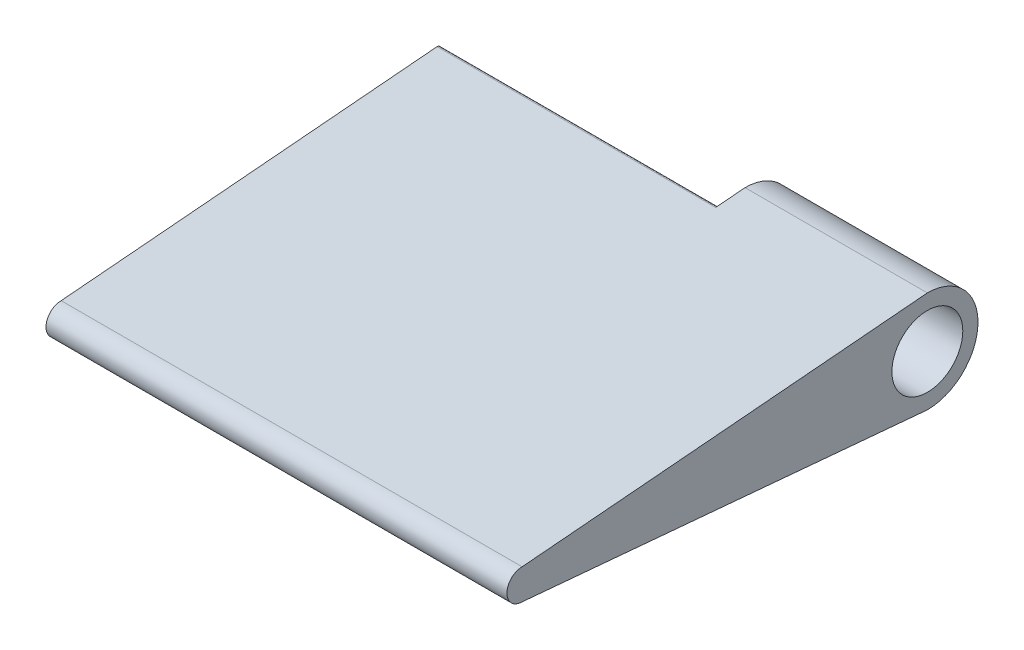
ISO-10303-21;
HEADER;
FILE_DESCRIPTION(('STEP AP214'),'2;1');
FILE_NAME('part.step','',(''),(''),'','','');
FILE_SCHEMA(('AUTOMOTIVE_DESIGN { 1 0 10303 214 1 1 1 1 }'));
ENDSEC;
DATA;
#1=APPLICATION_CONTEXT('core data for automotive mechanical design processes');
#2=APPLICATION_PROTOCOL_DEFINITION('international standard','automotive_design',2000,#1);
#3=PRODUCT_CONTEXT('',#1,'mechanical');
#4=PRODUCT('Part','Part','',(#3));
#5=PRODUCT_RELATED_PRODUCT_CATEGORY('part','',(#4));
#6=PRODUCT_DEFINITION_FORMATION('','',#4);
#7=PRODUCT_DEFINITION_CONTEXT('part definition',#1,'design');
#8=PRODUCT_DEFINITION('design','',#6,#7);
#9=PRODUCT_DEFINITION_SHAPE('','',#8);
#10=(LENGTH_UNIT() NAMED_UNIT(*) SI_UNIT(.MILLI.,.METRE.));
#11=(NAMED_UNIT(*) PLANE_ANGLE_UNIT() SI_UNIT($,.RADIAN.));
#12=(NAMED_UNIT(*) SI_UNIT($,.STERADIAN.) SOLID_ANGLE_UNIT());
#13=UNCERTAINTY_MEASURE_WITH_UNIT(LENGTH_MEASURE(1.E-05),#10,'distance_accuracy_value','');
#14=(GEOMETRIC_REPRESENTATION_CONTEXT(3) GLOBAL_UNCERTAINTY_ASSIGNED_CONTEXT((#13)) GLOBAL_UNIT_ASSIGNED_CONTEXT((#10,
#11,#12)) REPRESENTATION_CONTEXT('',''));
#15=CARTESIAN_POINT('',(0.,0.,0.));
#16=DIRECTION('',(0.,0.,1.));
#17=DIRECTION('',(1.,0.,0.));
#18=AXIS2_PLACEMENT_3D('',#15,#16,#17);
#19=CARTESIAN_POINT('',(-27.5,0.,0.));
#20=DIRECTION('',(1.,0.,0.));
#21=DIRECTION('',(0.,0.,-1.));
#22=AXIS2_PLACEMENT_3D('',#19,#20,#21);
#23=CYLINDRICAL_SURFACE('',#22,5.);
#24=CARTESIAN_POINT('',(-9.5,0.,0.));
#25=DIRECTION('',(-1.,0.,0.));
#26=DIRECTION('',(0.,0.,1.));
#27=AXIS2_PLACEMENT_3D('',#24,#25,#26);
#28=CIRCLE('',#27,5.);
#29=CARTESIAN_POINT('',(-9.5,-1.5377558092035,4.75765772951994));
#30=VERTEX_POINT('',#29);
#31=CARTESIAN_POINT('',(-9.5,-4.1876945933311,2.73188835661077));
#32=VERTEX_POINT('',#31);
#33=EDGE_CURVE('E73',#30,#32,#28,.F.);
#34=ORIENTED_EDGE('',*,*,#33,.F.);
#35=DIRECTION('',(1.,0.,0.));
#36=VECTOR('',#35,1.);
#37=CARTESIAN_POINT('',(-27.5,-1.5377558092035,4.75765772951995));
#38=LINE('',#37,#36);
#39=CARTESIAN_POINT('',(-27.5,-1.5377558092035,4.75765772951994));
#40=VERTEX_POINT('',#39);
#41=EDGE_CURVE('E146',#40,#30,#38,.T.);
#42=ORIENTED_EDGE('',*,*,#41,.F.);
#43=CARTESIAN_POINT('',(-27.5,0.,0.));
#44=DIRECTION('',(1.,0.,0.));
#45=DIRECTION('',(0.,0.,-1.));
#46=AXIS2_PLACEMENT_3D('',#43,#44,#45);
#47=CIRCLE('',#46,5.);
#48=CARTESIAN_POINT('',(-27.5,4.20184559186567,2.71007262303411));
#49=VERTEX_POINT('',#48);
#50=EDGE_CURVE('E186',#49,#40,#47,.T.);
#51=ORIENTED_EDGE('',*,*,#50,.F.);
#52=DIRECTION('',(1.,0.,0.));
#53=VECTOR('',#52,1.);
#54=CARTESIAN_POINT('',(-27.5,4.20184559186567,2.71007262303411));
#55=LINE('',#54,#53);
#56=CARTESIAN_POINT('',(0.,4.20184559186567,2.71007262303411));
#57=VERTEX_POINT('',#56);
#58=EDGE_CURVE('E203',#49,#57,#55,.T.);
#59=ORIENTED_EDGE('',*,*,#58,.T.);
#60=CARTESIAN_POINT('',(0.,0.,0.));
#61=DIRECTION('',(1.,0.,0.));
#62=DIRECTION('',(0.,0.,-1.));
#63=AXIS2_PLACEMENT_3D('',#60,#61,#62);
#64=CIRCLE('',#63,5.);
#65=CARTESIAN_POINT('',(0.,-4.1876945933311,2.73188835661077));
#66=VERTEX_POINT('',#65);
#67=EDGE_CURVE('E187',#57,#66,#64,.T.);
#68=ORIENTED_EDGE('',*,*,#67,.T.);
#69=DIRECTION('',(1.,0.,0.));
#70=VECTOR('',#69,1.);
#71=CARTESIAN_POINT('',(-27.5,-4.1876945933311,2.73188835661077));
#72=LINE('',#71,#70);
#73=EDGE_CURVE('E206',#66,#32,#72,.F.);
#74=ORIENTED_EDGE('',*,*,#73,.T.);
#75=EDGE_LOOP('',(#34,#42,#51,#59,#68,#74));
#76=FACE_BOUND('',#75,.T.);
#77=ADVANCED_FACE('F58',(#76),#23,.F.);
#78=CARTESIAN_POINT('',(-27.5,-4.9600647370598,0.445063466794253));
#79=DIRECTION('',(0.,-0.995998467575106,0.0893703115583744));
#80=DIRECTION('',(0.,-0.0893703115583744,-0.995998467575106));
#81=AXIS2_PLACEMENT_3D('',#78,#79,#80);
#82=PLANE('',#81);
#83=DIRECTION('',(1.,0.,0.));
#84=VECTOR('',#83,1.);
#85=CARTESIAN_POINT('',(-27.5,-1.5377558092035,38.5854077072533));
#86=LINE('',#85,#84);
#87=CARTESIAN_POINT('',(-27.5,-1.5377558092035,38.5854077072533));
#88=VERTEX_POINT('',#87);
#89=CARTESIAN_POINT('',(-9.5,-1.5377558092035,38.5854077072533));
#90=VERTEX_POINT('',#89);
#91=EDGE_CURVE('E143',#88,#90,#86,.T.);
#92=ORIENTED_EDGE('',*,*,#91,.T.);
#93=DIRECTION('',(0.,-0.0893703115583744,-0.995998467575106));
#94=VECTOR('',#93,1.);
#95=CARTESIAN_POINT('',(-9.5,-4.9600647370598,0.445063466794253));
#96=LINE('',#95,#94);
#97=CARTESIAN_POINT('',(-9.5,-4.73775580920349,2.92261275147493));
#98=VERTEX_POINT('',#97);
#99=EDGE_CURVE('E133',#90,#98,#96,.T.);
#100=ORIENTED_EDGE('',*,*,#99,.T.);
#101=DIRECTION('',(-1.,0.,0.));
#102=VECTOR('',#101,1.);
#103=CARTESIAN_POINT('',(0.,-4.7377558092035,2.92261275147493));
#104=LINE('',#103,#102);
#105=CARTESIAN_POINT('',(0.,-4.7377558092035,2.92261275147493));
#106=VERTEX_POINT('',#105);
#107=EDGE_CURVE('E198',#98,#106,#104,.F.);
#108=ORIENTED_EDGE('',*,*,#107,.T.);
#109=DIRECTION('',(0.,-0.0893703115583744,-0.995998467575106));
#110=VECTOR('',#109,1.);
#111=CARTESIAN_POINT('',(0.,-4.9600647370598,0.445063466794253));
#112=LINE('',#111,#110);
#113=CARTESIAN_POINT('',(0.,-5.,0.));
#114=VERTEX_POINT('',#113);
#115=EDGE_CURVE('E154',#106,#114,#112,.T.);
#116=ORIENTED_EDGE('',*,*,#115,.T.);
#117=DIRECTION('',(-1.,0.,0.));
#118=VECTOR('',#117,1.);
#119=CARTESIAN_POINT('',(18.,-5.,0.));
#120=LINE('',#119,#118);
#121=CARTESIAN_POINT('',(18.,-5.,0.));
#122=VERTEX_POINT('',#121);
#123=EDGE_CURVE('E181',#122,#114,#120,.T.);
#124=ORIENTED_EDGE('',*,*,#123,.F.);
#125=DIRECTION('',(0.,-0.0893703115583744,-0.995998467575106));
#126=VECTOR('',#125,1.);
#127=CARTESIAN_POINT('',(18.,-4.9600647370598,0.445063466794253));
#128=LINE('',#127,#126);
#129=CARTESIAN_POINT('',(18.,-1.41082533887995,40.));
#130=VERTEX_POINT('',#129);
#131=EDGE_CURVE('E161',#130,#122,#128,.T.);
#132=ORIENTED_EDGE('',*,*,#131,.F.);
#133=DIRECTION('',(1.,0.,0.));
#134=VECTOR('',#133,1.);
#135=CARTESIAN_POINT('',(-27.5,-1.41082533887994,40.));
#136=LINE('',#135,#134);
#137=CARTESIAN_POINT('',(-27.5,-1.41082533887994,40.));
#138=VERTEX_POINT('',#137);
#139=EDGE_CURVE('E193',#138,#130,#136,.T.);
#140=ORIENTED_EDGE('',*,*,#139,.F.);
#141=DIRECTION('',(0.,-0.0893703115583744,-0.995998467575106));
#142=VECTOR('',#141,1.);
#143=CARTESIAN_POINT('',(-27.5,-4.9600647370598,0.445063466794253));
#144=LINE('',#143,#142);
#145=EDGE_CURVE('E152',#138,#88,#144,.T.);
#146=ORIENTED_EDGE('',*,*,#145,.T.);
#147=EDGE_LOOP('',(#92,#100,#108,#116,#124,#132,#140,#146));
#148=FACE_BOUND('',#147,.T.);
#149=ADVANCED_FACE('F150',(#148),#82,.T.);
#150=CARTESIAN_POINT('',(-27.5,0.,0.));
#151=DIRECTION('',(1.,0.,0.));
#152=DIRECTION('',(0.,0.,-1.));
#153=AXIS2_PLACEMENT_3D('',#150,#151,#152);
#154=PLANE('',#153);
#155=DIRECTION('',(0.,0.,-1.));
#156=VECTOR('',#155,1.);
#157=CARTESIAN_POINT('',(-27.5,-1.5377558092035,48.));
#158=LINE('',#157,#156);
#159=EDGE_CURVE('E147',#88,#40,#158,.T.);
#160=ORIENTED_EDGE('',*,*,#159,.F.);
#161=ORIENTED_EDGE('',*,*,#145,.F.);
#162=CARTESIAN_POINT('',(-27.5,0.0891746611200548,40.));
#163=DIRECTION('',(1.,0.,0.));
#164=DIRECTION('',(0.,0.,-1.));
#165=AXIS2_PLACEMENT_3D('',#162,#163,#164);
#166=CIRCLE('',#165,1.5);
#167=CARTESIAN_POINT('',(-27.5,1.58917466112005,40.));
#168=VERTEX_POINT('',#167);
#169=EDGE_CURVE('E184',#168,#138,#166,.T.);
#170=ORIENTED_EDGE('',*,*,#169,.F.);
#171=DIRECTION('',(0.,0.084962309007415,-0.99638416589593));
#172=VECTOR('',#171,1.);
#173=CARTESIAN_POINT('',(-27.5,4.96390703024064,0.423275496964727));
#174=LINE('',#173,#172);
#175=CARTESIAN_POINT('',(-27.5,4.75287157714639,2.89816567311838));
#176=VERTEX_POINT('',#175);
#177=EDGE_CURVE('E190',#168,#176,#174,.T.);
#178=ORIENTED_EDGE('',*,*,#177,.T.);
#179=CARTESIAN_POINT('',(-27.5,4.45395632737761,2.87267698041616));
#180=DIRECTION('',(1.,0.,0.));
#181=DIRECTION('',(0.,0.,-1.));
#182=AXIS2_PLACEMENT_3D('',#179,#180,#181);
#183=CIRCLE('',#182,0.3);
#184=EDGE_CURVE('E209',#176,#49,#183,.F.);
#185=ORIENTED_EDGE('',*,*,#184,.T.);
#186=ORIENTED_EDGE('',*,*,#50,.T.);
#187=EDGE_LOOP('',(#160,#161,#170,#178,#185,#186));
#188=FACE_BOUND('',#187,.T.);
#189=ADVANCED_FACE('F226',(#188),#154,.F.);
#190=CARTESIAN_POINT('',(-27.5,-4.43895626893096,2.89580165800742));
#191=DIRECTION('',(1.,0.,0.));
#192=DIRECTION('',(0.,0.,-1.));
#193=AXIS2_PLACEMENT_3D('',#190,#191,#192);
#194=CYLINDRICAL_SURFACE('',#193,0.3);
#195=ORIENTED_EDGE('',*,*,#107,.F.);
#196=CARTESIAN_POINT('',(-9.5,-4.43895626893096,2.89580165800742));
#197=DIRECTION('',(-1.,0.,0.));
#198=DIRECTION('',(0.,0.,1.));
#199=AXIS2_PLACEMENT_3D('',#196,#197,#198);
#200=CIRCLE('',#199,0.3);
#201=EDGE_CURVE('E12',#98,#32,#200,.F.);
#202=ORIENTED_EDGE('',*,*,#201,.T.);
#203=ORIENTED_EDGE('',*,*,#73,.F.);
#204=CARTESIAN_POINT('',(0.,-4.43895626893096,2.89580165800742));
#205=DIRECTION('',(1.,0.,0.));
#206=DIRECTION('',(0.,0.,-1.));
#207=AXIS2_PLACEMENT_3D('',#204,#205,#206);
#208=CIRCLE('',#207,0.3);
#209=EDGE_CURVE('E213',#106,#66,#208,.T.);
#210=ORIENTED_EDGE('',*,*,#209,.F.);
#211=EDGE_LOOP('',(#195,#202,#203,#210));
#212=FACE_BOUND('',#211,.T.);
#213=ADVANCED_FACE('F245',(#212),#194,.T.);
#214=CARTESIAN_POINT('',(-27.5,4.96390703024064,0.423275496964727));
#215=DIRECTION('',(0.,-0.99638416589593,-0.084962309007415));
#216=DIRECTION('',(0.,0.084962309007415,-0.99638416589593));
#217=AXIS2_PLACEMENT_3D('',#214,#215,#216);
#218=PLANE('',#217);
#219=DIRECTION('',(0.,0.084962309007415,-0.99638416589593));
#220=VECTOR('',#219,1.);
#221=CARTESIAN_POINT('',(0.,4.96390703024064,0.423275496964727));
#222=LINE('',#221,#220);
#223=CARTESIAN_POINT('',(0.,4.75287157714639,2.89816567311838));
#224=VERTEX_POINT('',#223);
#225=CARTESIAN_POINT('',(0.,5.,0.));
#226=VERTEX_POINT('',#225);
#227=EDGE_CURVE('E80',#224,#226,#222,.T.);
#228=ORIENTED_EDGE('',*,*,#227,.F.);
#229=DIRECTION('',(1.,0.,0.));
#230=VECTOR('',#229,1.);
#231=CARTESIAN_POINT('',(-27.5,4.75287157714639,2.89816567311838));
#232=LINE('',#231,#230);
#233=EDGE_CURVE('E211',#224,#176,#232,.F.);
#234=ORIENTED_EDGE('',*,*,#233,.T.);
#235=ORIENTED_EDGE('',*,*,#177,.F.);
#236=DIRECTION('',(1.,0.,0.));
#237=VECTOR('',#236,1.);
#238=CARTESIAN_POINT('',(-27.5,1.58917466112005,40.));
#239=LINE('',#238,#237);
#240=CARTESIAN_POINT('',(18.,1.58917466112006,40.));
#241=VERTEX_POINT('',#240);
#242=EDGE_CURVE('E196',#168,#241,#239,.T.);
#243=ORIENTED_EDGE('',*,*,#242,.T.);
#244=DIRECTION('',(0.,0.084962309007415,-0.99638416589593));
#245=VECTOR('',#244,1.);
#246=CARTESIAN_POINT('',(18.,4.96390703024064,0.423275496964727));
#247=LINE('',#246,#245);
#248=CARTESIAN_POINT('',(18.,5.,0.));
#249=VERTEX_POINT('',#248);
#250=EDGE_CURVE('E166',#241,#249,#247,.T.);
#251=ORIENTED_EDGE('',*,*,#250,.T.);
#252=DIRECTION('',(-1.,0.,0.));
#253=VECTOR('',#252,1.);
#254=CARTESIAN_POINT('',(18.,5.,0.));
#255=LINE('',#254,#253);
#256=EDGE_CURVE('E172',#249,#226,#255,.T.);
#257=ORIENTED_EDGE('',*,*,#256,.T.);
#258=EDGE_LOOP('',(#228,#234,#235,#243,#251,#257));
#259=FACE_BOUND('',#258,.T.);
#260=ADVANCED_FACE('F223',(#259),#218,.F.);
#261=CARTESIAN_POINT('',(-27.5,0.0891746611200548,40.));
#262=DIRECTION('',(1.,0.,0.));
#263=DIRECTION('',(0.,0.,-1.));
#264=AXIS2_PLACEMENT_3D('',#261,#262,#263);
#265=CYLINDRICAL_SURFACE('',#264,1.5);
#266=ORIENTED_EDGE('',*,*,#242,.F.);
#267=ORIENTED_EDGE('',*,*,#169,.T.);
#268=ORIENTED_EDGE('',*,*,#139,.T.);
#269=CARTESIAN_POINT('',(18.,0.0891746611200548,40.));
#270=DIRECTION('',(1.,0.,0.));
#271=DIRECTION('',(0.,0.,-1.));
#272=AXIS2_PLACEMENT_3D('',#269,#270,#271);
#273=CIRCLE('',#272,1.5);
#274=EDGE_CURVE('E158',#241,#130,#273,.T.);
#275=ORIENTED_EDGE('',*,*,#274,.F.);
#276=EDGE_LOOP('',(#266,#267,#268,#275));
#277=FACE_BOUND('',#276,.T.);
#278=ADVANCED_FACE('F229',(#277),#265,.T.);
#279=CARTESIAN_POINT('',(0.,0.,0.));
#280=DIRECTION('',(1.,0.,0.));
#281=DIRECTION('',(0.,0.,-1.));
#282=AXIS2_PLACEMENT_3D('',#279,#280,#281);
#283=PLANE('',#282);
#284=CARTESIAN_POINT('',(0.,0.,0.));
#285=DIRECTION('',(1.,0.,0.));
#286=DIRECTION('',(0.,0.,-1.));
#287=AXIS2_PLACEMENT_3D('',#284,#285,#286);
#288=CIRCLE('',#287,3.5);
#289=CARTESIAN_POINT('',(0.,0.,-3.5));
#290=VERTEX_POINT('',#289);
#291=EDGE_CURVE('E162',#290,#290,#288,.T.);
#292=ORIENTED_EDGE('',*,*,#291,.T.);
#293=EDGE_LOOP('',(#292));
#294=FACE_BOUND('',#293,.T.);
#295=ORIENTED_EDGE('',*,*,#67,.F.);
#296=CARTESIAN_POINT('',(0.,4.45395632737761,2.87267698041616));
#297=DIRECTION('',(1.,0.,0.));
#298=DIRECTION('',(0.,0.,-1.));
#299=AXIS2_PLACEMENT_3D('',#296,#297,#298);
#300=CIRCLE('',#299,0.3);
#301=EDGE_CURVE('E66',#57,#224,#300,.T.);
#302=ORIENTED_EDGE('',*,*,#301,.T.);
#303=ORIENTED_EDGE('',*,*,#227,.T.);
#304=CARTESIAN_POINT('',(0.,0.,0.));
#305=DIRECTION('',(1.,0.,0.));
#306=DIRECTION('',(0.,0.,-1.));
#307=AXIS2_PLACEMENT_3D('',#304,#305,#306);
#308=CIRCLE('',#307,5.);
#309=EDGE_CURVE('E174',#114,#226,#308,.T.);
#310=ORIENTED_EDGE('',*,*,#309,.F.);
#311=ORIENTED_EDGE('',*,*,#115,.F.);
#312=ORIENTED_EDGE('',*,*,#209,.T.);
#313=EDGE_LOOP('',(#295,#302,#303,#310,#311,#312));
#314=FACE_BOUND('',#313,.T.);
#315=ADVANCED_FACE('F217',(#294,#314),#283,.F.);
#316=CARTESIAN_POINT('',(18.,0.,0.));
#317=DIRECTION('',(-1.,0.,0.));
#318=DIRECTION('',(0.,0.,1.));
#319=AXIS2_PLACEMENT_3D('',#316,#317,#318);
#320=CYLINDRICAL_SURFACE('',#319,5.);
#321=ORIENTED_EDGE('',*,*,#309,.T.);
#322=ORIENTED_EDGE('',*,*,#256,.F.);
#323=CARTESIAN_POINT('',(18.,0.,0.));
#324=DIRECTION('',(1.,0.,0.));
#325=DIRECTION('',(0.,0.,-1.));
#326=AXIS2_PLACEMENT_3D('',#323,#324,#325);
#327=CIRCLE('',#326,5.);
#328=EDGE_CURVE('E164',#122,#249,#327,.T.);
#329=ORIENTED_EDGE('',*,*,#328,.F.);
#330=ORIENTED_EDGE('',*,*,#123,.T.);
#331=EDGE_LOOP('',(#321,#322,#329,#330));
#332=FACE_BOUND('',#331,.T.);
#333=ADVANCED_FACE('F240',(#332),#320,.T.);
#334=CARTESIAN_POINT('',(18.,0.,0.));
#335=DIRECTION('',(-1.,0.,0.));
#336=DIRECTION('',(0.,0.,1.));
#337=AXIS2_PLACEMENT_3D('',#334,#335,#336);
#338=CYLINDRICAL_SURFACE('',#337,3.5);
#339=CARTESIAN_POINT('',(18.,0.,0.));
#340=DIRECTION('',(1.,0.,0.));
#341=DIRECTION('',(0.,0.,-1.));
#342=AXIS2_PLACEMENT_3D('',#339,#340,#341);
#343=CIRCLE('',#342,3.5);
#344=CARTESIAN_POINT('',(18.,0.,-3.5));
#345=VERTEX_POINT('',#344);
#346=EDGE_CURVE('E169',#345,#345,#343,.T.);
#347=ORIENTED_EDGE('',*,*,#346,.T.);
#348=EDGE_LOOP('',(#347));
#349=FACE_BOUND('',#348,.T.);
#350=ORIENTED_EDGE('',*,*,#291,.F.);
#351=EDGE_LOOP('',(#350));
#352=FACE_BOUND('',#351,.T.);
#353=ADVANCED_FACE('F270',(#349,#352),#338,.F.);
#354=CARTESIAN_POINT('',(18.,0.,0.));
#355=DIRECTION('',(1.,0.,0.));
#356=DIRECTION('',(0.,0.,-1.));
#357=AXIS2_PLACEMENT_3D('',#354,#355,#356);
#358=PLANE('',#357);
#359=ORIENTED_EDGE('',*,*,#274,.T.);
#360=ORIENTED_EDGE('',*,*,#131,.T.);
#361=ORIENTED_EDGE('',*,*,#328,.T.);
#362=ORIENTED_EDGE('',*,*,#250,.F.);
#363=EDGE_LOOP('',(#359,#360,#361,#362));
#364=FACE_BOUND('',#363,.T.);
#365=ORIENTED_EDGE('',*,*,#346,.F.);
#366=EDGE_LOOP('',(#365));
#367=FACE_BOUND('',#366,.T.);
#368=ADVANCED_FACE('F235',(#364,#367),#358,.T.);
#369=CARTESIAN_POINT('',(-27.5,4.45395632737761,2.87267698041616));
#370=DIRECTION('',(1.,0.,0.));
#371=DIRECTION('',(0.,0.,-1.));
#372=AXIS2_PLACEMENT_3D('',#369,#370,#371);
#373=CYLINDRICAL_SURFACE('',#372,0.3);
#374=ORIENTED_EDGE('',*,*,#184,.F.);
#375=ORIENTED_EDGE('',*,*,#233,.F.);
#376=ORIENTED_EDGE('',*,*,#301,.F.);
#377=ORIENTED_EDGE('',*,*,#58,.F.);
#378=EDGE_LOOP('',(#374,#375,#376,#377));
#379=FACE_BOUND('',#378,.T.);
#380=ADVANCED_FACE('F60',(#379),#373,.T.);
#381=CARTESIAN_POINT('',(-27.5,-1.5377558092035,48.));
#382=DIRECTION('',(0.,-1.,0.));
#383=DIRECTION('',(1.,0.,0.));
#384=AXIS2_PLACEMENT_3D('',#381,#382,#383);
#385=PLANE('',#384);
#386=ORIENTED_EDGE('',*,*,#41,.T.);
#387=DIRECTION('',(0.,0.,-1.));
#388=VECTOR('',#387,1.);
#389=CARTESIAN_POINT('',(-9.5,-1.5377558092035,48.));
#390=LINE('',#389,#388);
#391=EDGE_CURVE('E136',#90,#30,#390,.T.);
#392=ORIENTED_EDGE('',*,*,#391,.F.);
#393=ORIENTED_EDGE('',*,*,#91,.F.);
#394=ORIENTED_EDGE('',*,*,#159,.T.);
#395=EDGE_LOOP('',(#386,#392,#393,#394));
#396=FACE_BOUND('',#395,.T.);
#397=ADVANCED_FACE('F142',(#396),#385,.T.);
#398=CARTESIAN_POINT('',(-9.5,-1.5377558092035,48.));
#399=DIRECTION('',(-1.,0.,0.));
#400=DIRECTION('',(0.,0.,1.));
#401=AXIS2_PLACEMENT_3D('',#398,#399,#400);
#402=PLANE('',#401);
#403=ORIENTED_EDGE('',*,*,#33,.T.);
#404=ORIENTED_EDGE('',*,*,#201,.F.);
#405=ORIENTED_EDGE('',*,*,#99,.F.);
#406=ORIENTED_EDGE('',*,*,#391,.T.);
#407=EDGE_LOOP('',(#403,#404,#405,#406));
#408=FACE_BOUND('',#407,.T.);
#409=ADVANCED_FACE('F135',(#408),#402,.T.);
#410=CLOSED_SHELL('',(#77,#149,#189,#213,#260,#278,#315,#333,#353,#368,#380,#397,#409));
#411=MANIFOLD_SOLID_BREP('B2',#410);
#412=ADVANCED_BREP_SHAPE_REPRESENTATION('',(#18,#411),#14);
#413=SHAPE_DEFINITION_REPRESENTATION(#9,#412);
ENDSEC;
END-ISO-10303-21;
